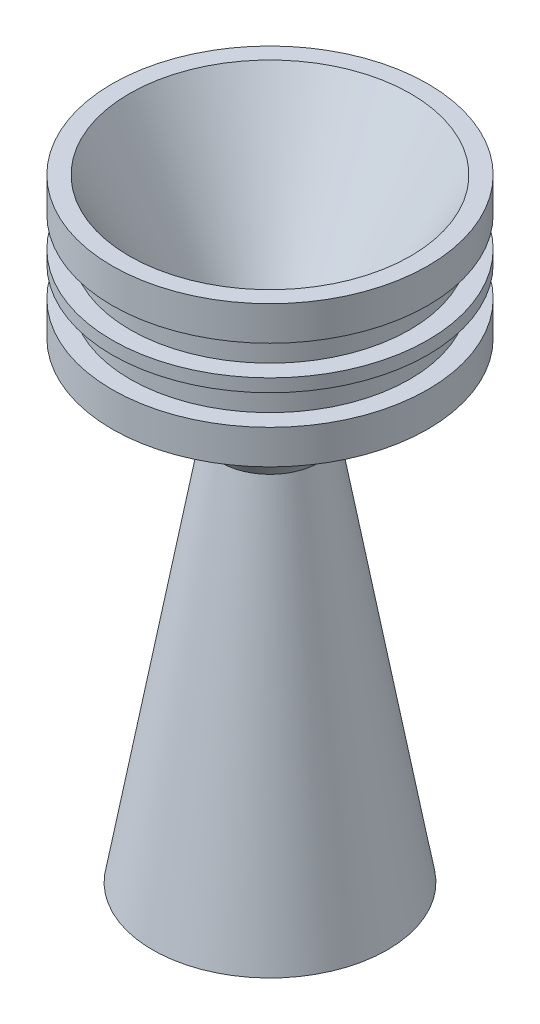
ISO-10303-21;
HEADER;
FILE_DESCRIPTION(('STEP AP214'),'2;1');
FILE_NAME('part.step','',(''),(''),'','','');
FILE_SCHEMA(('AUTOMOTIVE_DESIGN { 1 0 10303 214 1 1 1 1 }'));
ENDSEC;
DATA;
#1=APPLICATION_CONTEXT('core data for automotive mechanical design processes');
#2=APPLICATION_PROTOCOL_DEFINITION('international standard','automotive_design',2000,#1);
#3=PRODUCT_CONTEXT('',#1,'mechanical');
#4=PRODUCT('Part','Part','',(#3));
#5=PRODUCT_RELATED_PRODUCT_CATEGORY('part','',(#4));
#6=PRODUCT_DEFINITION_FORMATION('','',#4);
#7=PRODUCT_DEFINITION_CONTEXT('part definition',#1,'design');
#8=PRODUCT_DEFINITION('design','',#6,#7);
#9=PRODUCT_DEFINITION_SHAPE('','',#8);
#10=(LENGTH_UNIT() NAMED_UNIT(*) SI_UNIT(.MILLI.,.METRE.));
#11=(NAMED_UNIT(*) PLANE_ANGLE_UNIT() SI_UNIT($,.RADIAN.));
#12=(NAMED_UNIT(*) SI_UNIT($,.STERADIAN.) SOLID_ANGLE_UNIT());
#13=UNCERTAINTY_MEASURE_WITH_UNIT(LENGTH_MEASURE(1.E-05),#10,'distance_accuracy_value','');
#14=(GEOMETRIC_REPRESENTATION_CONTEXT(3) GLOBAL_UNCERTAINTY_ASSIGNED_CONTEXT((#13)) GLOBAL_UNIT_ASSIGNED_CONTEXT((#10,
#11,#12)) REPRESENTATION_CONTEXT('',''));
#15=CARTESIAN_POINT('',(0.,0.,0.));
#16=DIRECTION('',(0.,0.,1.));
#17=DIRECTION('',(1.,0.,0.));
#18=AXIS2_PLACEMENT_3D('',#15,#16,#17);
#19=CARTESIAN_POINT('',(0.,7.39312220767089,0.));
#20=DIRECTION('',(0.,-1.,0.));
#21=DIRECTION('',(1.,0.,0.));
#22=AXIS2_PLACEMENT_3D('',#19,#20,#21);
#23=PLANE('',#22);
#24=CARTESIAN_POINT('',(0.,7.3931222076709,0.));
#25=DIRECTION('',(0.,1.,0.));
#26=DIRECTION('',(-1.,0.,0.));
#27=AXIS2_PLACEMENT_3D('',#24,#25,#26);
#28=CIRCLE('',#27,11.4705977343054);
#29=CARTESIAN_POINT('',(-11.4705977343054,7.39312220767089,0.));
#30=VERTEX_POINT('',#29);
#31=EDGE_CURVE('E10',#30,#30,#28,.T.);
#32=ORIENTED_EDGE('',*,*,#31,.T.);
#33=EDGE_LOOP('',(#32));
#34=FACE_BOUND('',#33,.T.);
#35=CARTESIAN_POINT('',(0.,7.3931222076709,0.));
#36=DIRECTION('',(0.,1.,0.));
#37=DIRECTION('',(-1.,0.,0.));
#38=AXIS2_PLACEMENT_3D('',#35,#36,#37);
#39=CIRCLE('',#38,18.42);
#40=CARTESIAN_POINT('',(-18.42,7.39312220767089,0.));
#41=VERTEX_POINT('',#40);
#42=EDGE_CURVE('E87',#41,#41,#39,.T.);
#43=ORIENTED_EDGE('',*,*,#42,.F.);
#44=EDGE_LOOP('',(#43));
#45=FACE_BOUND('',#44,.T.);
#46=ADVANCED_FACE('F32',(#34,#45),#23,.T.);
#47=CARTESIAN_POINT('',(0.,7.3931222076709,0.));
#48=DIRECTION('',(0.,1.,0.));
#49=DIRECTION('',(-1.,0.,0.));
#50=AXIS2_PLACEMENT_3D('',#47,#48,#49);
#51=CONICAL_SURFACE('',#50,11.4705977343054,0.533655116690971);
#52=CARTESIAN_POINT('',(0.,-2.34542155856362,0.));
#53=DIRECTION('',(0.,1.,0.));
#54=DIRECTION('',(-1.,0.,0.));
#55=AXIS2_PLACEMENT_3D('',#52,#53,#54);
#56=CIRCLE('',#55,5.71670101973869);
#57=CARTESIAN_POINT('',(-5.71670101973869,-2.34542155856362,0.));
#58=VERTEX_POINT('',#57);
#59=EDGE_CURVE('E38',#58,#58,#56,.T.);
#60=ORIENTED_EDGE('',*,*,#59,.T.);
#61=EDGE_LOOP('',(#60));
#62=FACE_BOUND('',#61,.T.);
#63=ORIENTED_EDGE('',*,*,#31,.F.);
#64=EDGE_LOOP('',(#63));
#65=FACE_BOUND('',#64,.T.);
#66=ADVANCED_FACE('F95',(#62,#65),#51,.T.);
#67=CARTESIAN_POINT('',(0.,-47.6104108756905,0.));
#68=DIRECTION('',(0.,-1.,0.));
#69=DIRECTION('',(1.,0.,0.));
#70=AXIS2_PLACEMENT_3D('',#67,#68,#69);
#71=CONICAL_SURFACE('',#70,13.6981399178286,0.174532925199433);
#72=ORIENTED_EDGE('',*,*,#59,.F.);
#73=EDGE_LOOP('',(#72));
#74=FACE_BOUND('',#73,.T.);
#75=CARTESIAN_POINT('',(0.,-47.6104108756905,0.));
#76=DIRECTION('',(0.,1.,0.));
#77=DIRECTION('',(-1.,0.,0.));
#78=AXIS2_PLACEMENT_3D('',#75,#76,#77);
#79=CIRCLE('',#78,13.6981399178286);
#80=CARTESIAN_POINT('',(-13.6981399178286,-47.6104108756905,0.));
#81=VERTEX_POINT('',#80);
#82=EDGE_CURVE('E42',#81,#81,#79,.T.);
#83=ORIENTED_EDGE('',*,*,#82,.T.);
#84=EDGE_LOOP('',(#83));
#85=FACE_BOUND('',#84,.T.);
#86=ADVANCED_FACE('F99',(#74,#85),#71,.T.);
#87=CARTESIAN_POINT('',(0.,-47.6104108756905,0.));
#88=DIRECTION('',(0.,1.,0.));
#89=DIRECTION('',(-1.,0.,0.));
#90=AXIS2_PLACEMENT_3D('',#87,#88,#89);
#91=PLANE('',#90);
#92=ORIENTED_EDGE('',*,*,#82,.F.);
#93=EDGE_LOOP('',(#92));
#94=FACE_BOUND('',#93,.T.);
#95=CARTESIAN_POINT('',(0.,-47.6104108756905,0.));
#96=DIRECTION('',(0.,1.,0.));
#97=DIRECTION('',(-1.,0.,0.));
#98=AXIS2_PLACEMENT_3D('',#95,#96,#97);
#99=CIRCLE('',#98,12.175);
#100=CARTESIAN_POINT('',(12.175,-47.6104108756905,0.));
#101=VERTEX_POINT('',#100);
#102=EDGE_CURVE('E46',#101,#101,#99,.T.);
#103=ORIENTED_EDGE('',*,*,#102,.T.);
#104=EDGE_LOOP('',(#103));
#105=FACE_BOUND('',#104,.T.);
#106=ADVANCED_FACE('F103',(#94,#105),#91,.F.);
#107=CARTESIAN_POINT('',(0.,0.,0.));
#108=DIRECTION('',(0.,-1.,0.));
#109=DIRECTION('',(1.,0.,0.));
#110=AXIS2_PLACEMENT_3D('',#107,#108,#109);
#111=CONICAL_SURFACE('',#110,3.78000000000001,0.174532925199433);
#112=CARTESIAN_POINT('',(0.,0.,0.));
#113=DIRECTION('',(0.,1.,0.));
#114=DIRECTION('',(-1.,0.,0.));
#115=AXIS2_PLACEMENT_3D('',#112,#113,#114);
#116=CIRCLE('',#115,3.78000000000001);
#117=CARTESIAN_POINT('',(3.78000000000001,0.,0.));
#118=VERTEX_POINT('',#117);
#119=EDGE_CURVE('E51',#118,#118,#116,.T.);
#120=CARTESIAN_POINT('',(12.175,-47.6104108756905,0.));
#121=CARTESIAN_POINT('',(12.0875520833333,-47.1144690957354,0.));
#122=CARTESIAN_POINT('',(12.0001041666667,-46.6185273157803,0.));
#123=CARTESIAN_POINT('',(11.8252083333333,-45.6266437558701,0.));
#124=CARTESIAN_POINT('',(11.7377604166667,-45.130701975915,0.));
#125=CARTESIAN_POINT('',(11.5628645833333,-44.1388184160048,0.));
#126=CARTESIAN_POINT('',(11.4754166666667,-43.6428766360497,0.));
#127=CARTESIAN_POINT('',(11.3005208333333,-42.6509930761395,0.));
#128=CARTESIAN_POINT('',(11.2130729166667,-42.1550512961843,0.));
#129=CARTESIAN_POINT('',(11.0381770833333,-41.1631677362741,0.));
#130=CARTESIAN_POINT('',(10.9507291666667,-40.667225956319,0.));
#131=CARTESIAN_POINT('',(10.7758333333333,-39.6753423964088,0.));
#132=CARTESIAN_POINT('',(10.6883854166667,-39.1794006164537,0.));
#133=CARTESIAN_POINT('',(10.5134895833333,-38.1875170565435,0.));
#134=CARTESIAN_POINT('',(10.4260416666667,-37.6915752765883,0.));
#135=CARTESIAN_POINT('',(10.2511458333333,-36.6996917166781,0.));
#136=CARTESIAN_POINT('',(10.1636979166667,-36.203749936723,0.));
#137=CARTESIAN_POINT('',(9.98880208333334,-35.2118663768128,0.));
#138=CARTESIAN_POINT('',(9.90135416666668,-34.7159245968577,0.));
#139=CARTESIAN_POINT('',(9.72645833333334,-33.7240410369475,0.));
#140=CARTESIAN_POINT('',(9.63901041666668,-33.2280992569924,0.));
#141=CARTESIAN_POINT('',(9.46411458333334,-32.2362156970821,0.));
#142=CARTESIAN_POINT('',(9.37666666666668,-31.740273917127,0.));
#143=CARTESIAN_POINT('',(9.20177083333334,-30.7483903572168,0.));
#144=CARTESIAN_POINT('',(9.11432291666668,-30.2524485772617,0.));
#145=CARTESIAN_POINT('',(8.93942708333334,-29.2605650173515,0.));
#146=CARTESIAN_POINT('',(8.85197916666668,-28.7646232373964,0.));
#147=CARTESIAN_POINT('',(8.67708333333334,-27.7727396774861,0.));
#148=CARTESIAN_POINT('',(8.58963541666668,-27.276797897531,0.));
#149=CARTESIAN_POINT('',(8.41473958333334,-26.2849143376208,0.));
#150=CARTESIAN_POINT('',(8.32729166666668,-25.7889725576657,0.));
#151=CARTESIAN_POINT('',(8.15239583333334,-24.7970889977555,0.));
#152=CARTESIAN_POINT('',(8.06494791666668,-24.3011472178004,0.));
#153=CARTESIAN_POINT('',(7.89005208333334,-23.3092636578902,0.));
#154=CARTESIAN_POINT('',(7.80260416666668,-22.8133218779351,0.));
#155=CARTESIAN_POINT('',(7.62770833333334,-21.8214383180248,0.));
#156=CARTESIAN_POINT('',(7.54026041666668,-21.3254965380697,0.));
#157=CARTESIAN_POINT('',(7.36536458333334,-20.3336129781595,0.));
#158=CARTESIAN_POINT('',(7.27791666666668,-19.8376711982044,0.));
#159=CARTESIAN_POINT('',(7.10302083333334,-18.8457876382942,0.));
#160=CARTESIAN_POINT('',(7.01557291666668,-18.3498458583391,0.));
#161=CARTESIAN_POINT('',(6.84067708333334,-17.3579622984288,0.));
#162=CARTESIAN_POINT('',(6.75322916666668,-16.8620205184737,0.));
#163=CARTESIAN_POINT('',(6.57833333333334,-15.8701369585635,0.));
#164=CARTESIAN_POINT('',(6.49088541666668,-15.3741951786084,0.));
#165=CARTESIAN_POINT('',(6.31598958333334,-14.3823116186982,0.));
#166=CARTESIAN_POINT('',(6.22854166666668,-13.8863698387431,0.));
#167=CARTESIAN_POINT('',(6.05364583333334,-12.8944862788329,0.));
#168=CARTESIAN_POINT('',(5.96619791666668,-12.3985444988777,0.));
#169=CARTESIAN_POINT('',(5.79130208333334,-11.4066609389675,0.));
#170=CARTESIAN_POINT('',(5.70385416666668,-10.9107191590124,0.));
#171=CARTESIAN_POINT('',(5.52895833333334,-9.9188355991022,0.));
#172=CARTESIAN_POINT('',(5.44151041666668,-9.42289381914709,0.));
#173=CARTESIAN_POINT('',(5.26661458333334,-8.43101025923687,0.));
#174=CARTESIAN_POINT('',(5.17916666666668,-7.93506847928176,0.));
#175=CARTESIAN_POINT('',(5.00427083333334,-6.94318491937154,0.));
#176=CARTESIAN_POINT('',(4.91682291666668,-6.44724313941642,0.));
#177=CARTESIAN_POINT('',(4.74192708333334,-5.4553595795062,0.));
#178=CARTESIAN_POINT('',(4.65447916666668,-4.95941779955109,0.));
#179=CARTESIAN_POINT('',(4.47958333333334,-3.96753423964087,0.));
#180=CARTESIAN_POINT('',(4.39213541666668,-3.47159245968577,0.));
#181=CARTESIAN_POINT('',(4.21723958333334,-2.47970889977555,0.));
#182=CARTESIAN_POINT('',(4.12979166666668,-1.98376711982044,0.));
#183=CARTESIAN_POINT('',(3.95489583333334,-0.991883559910219,0.));
#184=CARTESIAN_POINT('',(3.86744791666668,-0.495941779955109,0.));
#185=CARTESIAN_POINT('',(3.78000000000001,0.,0.));
#186=B_SPLINE_CURVE_WITH_KNOTS('',3,(#120,#121,#122,#123,#124,#125,#126,#127,#128,#129,#130,
#131,#132,#133,#134,#135,#136,#137,#138,#139,#140,#141,#142,#143,#144,#145,#146,#147,#148,#149,
#150,#151,#152,#153,#154,#155,#156,#157,#158,#159,#160,#161,#162,#163,#164,#165,#166,#167,#168,
#169,#170,#171,#172,#173,#174,#175,#176,#177,#178,#179,#180,#181,#182,#183,#184,#185),
.UNSPECIFIED.,.F.,.F.,(4,2,2,2,2,2,2,2,2,2,2,2,2,2,2,2,2,2,2,2,2,2,2,2,2,2,2,2,2,2,2,2,4),(0.,
1.51077744393721,3.02155488787441,4.53233233181162,6.04310977574883,7.55388721968605,
9.06466466362325,10.5754421075605,12.0862195514977,13.5969969954349,15.1077744393721,
16.6185518833093,18.1293293272465,19.6401067711837,21.1508842151209,22.6616616590581,
24.1724391029953,25.6832165469325,27.1939939908698,28.704771434807,30.2155488787442,
31.7263263226814,33.2371037666186,34.7478812105558,36.258658654493,37.7694360984302,
39.2802135423674,40.7909909863046,42.3017684302418,43.8125458741791,45.3233233181163,
46.8341007620535,48.3448782059907),.UNSPECIFIED.);
#187=EDGE_CURVE('BSEAM110',#101,#118,#186,.T.);
#188=ORIENTED_EDGE('',*,*,#102,.F.);
#189=ORIENTED_EDGE('',*,*,#119,.T.);
#190=ORIENTED_EDGE('',*,*,#187,.T.);
#191=ORIENTED_EDGE('',*,*,#187,.F.);
#192=EDGE_LOOP('',(#188,#190,#189,#191));
#193=FACE_BOUND('',#192,.T.);
#194=ADVANCED_FACE('F110',(#193),#111,.F.);
#195=CARTESIAN_POINT('',(0.,41.7491771597277,0.));
#196=DIRECTION('',(0.,1.,0.));
#197=DIRECTION('',(-1.,0.,0.));
#198=AXIS2_PLACEMENT_3D('',#195,#196,#197);
#199=CYLINDRICAL_SURFACE('',#198,3.78);
#200=CARTESIAN_POINT('',(0.,2.,0.));
#201=DIRECTION('',(0.,1.,0.));
#202=DIRECTION('',(-1.,0.,0.));
#203=AXIS2_PLACEMENT_3D('',#200,#201,#202);
#204=CIRCLE('',#203,3.78);
#205=CARTESIAN_POINT('',(-3.78,2.,0.));
#206=VERTEX_POINT('',#205);
#207=EDGE_CURVE('E54',#206,#206,#204,.T.);
#208=ORIENTED_EDGE('',*,*,#207,.T.);
#209=EDGE_LOOP('',(#208));
#210=FACE_BOUND('',#209,.T.);
#211=ORIENTED_EDGE('',*,*,#119,.F.);
#212=EDGE_LOOP('',(#211));
#213=FACE_BOUND('',#212,.T.);
#214=ADVANCED_FACE('F114',(#210,#213),#199,.F.);
#215=CARTESIAN_POINT('',(0.,2.,0.));
#216=DIRECTION('',(0.,1.,0.));
#217=DIRECTION('',(-1.,0.,0.));
#218=AXIS2_PLACEMENT_3D('',#215,#216,#217);
#219=CONICAL_SURFACE('',#218,3.78,0.523598775598293);
#220=CARTESIAN_POINT('',(0.,23.8931222076709,0.));
#221=DIRECTION('',(0.,1.,0.));
#222=DIRECTION('',(-1.,0.,0.));
#223=AXIS2_PLACEMENT_3D('',#220,#221,#222);
#224=CIRCLE('',#223,16.42);
#225=CARTESIAN_POINT('',(-16.42,23.8931222076709,0.));
#226=VERTEX_POINT('',#225);
#227=EDGE_CURVE('E57',#226,#226,#224,.T.);
#228=CARTESIAN_POINT('',(-16.42,23.8931222076709,0.));
#229=CARTESIAN_POINT('',(-16.2883333333333,23.665068851341,0.));
#230=CARTESIAN_POINT('',(-16.1566666666667,23.4370154950111,0.));
#231=CARTESIAN_POINT('',(-15.8933333333333,22.9809087823513,0.));
#232=CARTESIAN_POINT('',(-15.7616666666667,22.7528554260214,0.));
#233=CARTESIAN_POINT('',(-15.4983333333333,22.2967487133616,0.));
#234=CARTESIAN_POINT('',(-15.3666666666667,22.0686953570317,0.));
#235=CARTESIAN_POINT('',(-15.1033333333333,21.6125886443719,0.));
#236=CARTESIAN_POINT('',(-14.9716666666667,21.3845352880419,0.));
#237=CARTESIAN_POINT('',(-14.7083333333333,20.9284285753821,0.));
#238=CARTESIAN_POINT('',(-14.5766666666667,20.7003752190522,0.));
#239=CARTESIAN_POINT('',(-14.3133333333333,20.2442685063924,0.));
#240=CARTESIAN_POINT('',(-14.1816666666667,20.0162151500625,0.));
#241=CARTESIAN_POINT('',(-13.9183333333333,19.5601084374027,0.));
#242=CARTESIAN_POINT('',(-13.7866666666667,19.3320550810728,0.));
#243=CARTESIAN_POINT('',(-13.5233333333333,18.875948368413,0.));
#244=CARTESIAN_POINT('',(-13.3916666666667,18.6478950120831,0.));
#245=CARTESIAN_POINT('',(-13.1283333333333,18.1917882994233,0.));
#246=CARTESIAN_POINT('',(-12.9966666666667,17.9637349430934,0.));
#247=CARTESIAN_POINT('',(-12.7333333333333,17.5076282304336,0.));
#248=CARTESIAN_POINT('',(-12.6016666666667,17.2795748741037,0.));
#249=CARTESIAN_POINT('',(-12.3383333333333,16.8234681614438,0.));
#250=CARTESIAN_POINT('',(-12.2066666666667,16.5954148051139,0.));
#251=CARTESIAN_POINT('',(-11.9433333333333,16.1393080924541,0.));
#252=CARTESIAN_POINT('',(-11.8116666666667,15.9112547361242,0.));
#253=CARTESIAN_POINT('',(-11.5483333333333,15.4551480234644,0.));
#254=CARTESIAN_POINT('',(-11.4166666666667,15.2270946671345,0.));
#255=CARTESIAN_POINT('',(-11.1533333333333,14.7709879544747,0.));
#256=CARTESIAN_POINT('',(-11.0216666666667,14.5429345981448,0.));
#257=CARTESIAN_POINT('',(-10.7583333333333,14.086827885485,0.));
#258=CARTESIAN_POINT('',(-10.6266666666667,13.8587745291551,0.));
#259=CARTESIAN_POINT('',(-10.3633333333333,13.4026678164953,0.));
#260=CARTESIAN_POINT('',(-10.2316666666667,13.1746144601654,0.));
#261=CARTESIAN_POINT('',(-9.96833333333333,12.7185077475055,0.));
#262=CARTESIAN_POINT('',(-9.83666666666667,12.4904543911756,0.));
#263=CARTESIAN_POINT('',(-9.57333333333333,12.0343476785158,0.));
#264=CARTESIAN_POINT('',(-9.44166666666667,11.8062943221859,0.));
#265=CARTESIAN_POINT('',(-9.17833333333333,11.3501876095261,0.));
#266=CARTESIAN_POINT('',(-9.04666666666667,11.1221342531962,0.));
#267=CARTESIAN_POINT('',(-8.78333333333333,10.6660275405364,0.));
#268=CARTESIAN_POINT('',(-8.65166666666667,10.4379741842065,0.));
#269=CARTESIAN_POINT('',(-8.38833333333333,9.98186747154669,0.));
#270=CARTESIAN_POINT('',(-8.25666666666667,9.75381411521678,0.));
#271=CARTESIAN_POINT('',(-7.99333333333333,9.29770740255697,0.));
#272=CARTESIAN_POINT('',(-7.86166666666667,9.06965404622706,0.));
#273=CARTESIAN_POINT('',(-7.59833333333333,8.61354733356725,0.));
#274=CARTESIAN_POINT('',(-7.46666666666667,8.38549397723735,0.));
#275=CARTESIAN_POINT('',(-7.20333333333333,7.92938726457754,0.));
#276=CARTESIAN_POINT('',(-7.07166666666667,7.70133390824763,0.));
#277=CARTESIAN_POINT('',(-6.80833333333333,7.24522719558782,0.));
#278=CARTESIAN_POINT('',(-6.67666666666667,7.01717383925792,0.));
#279=CARTESIAN_POINT('',(-6.41333333333333,6.56106712659811,0.));
#280=CARTESIAN_POINT('',(-6.28166666666667,6.3330137702682,0.));
#281=CARTESIAN_POINT('',(-6.01833333333333,5.87690705760839,0.));
#282=CARTESIAN_POINT('',(-5.88666666666667,5.64885370127848,0.));
#283=CARTESIAN_POINT('',(-5.62333333333333,5.19274698861867,0.));
#284=CARTESIAN_POINT('',(-5.49166666666667,4.96469363228877,0.));
#285=CARTESIAN_POINT('',(-5.22833333333333,4.50858691962896,0.));
#286=CARTESIAN_POINT('',(-5.09666666666666,4.28053356329905,0.));
#287=CARTESIAN_POINT('',(-4.83333333333333,3.82442685063924,0.));
#288=CARTESIAN_POINT('',(-4.70166666666667,3.59637349430934,0.));
#289=CARTESIAN_POINT('',(-4.43833333333333,3.14026678164953,0.));
#290=CARTESIAN_POINT('',(-4.30666666666667,2.91221342531962,0.));
#291=CARTESIAN_POINT('',(-4.04333333333333,2.45610671265981,0.));
#292=CARTESIAN_POINT('',(-3.91166666666667,2.22805335632991,0.));
#293=CARTESIAN_POINT('',(-3.78,2.,0.));
#294=B_SPLINE_CURVE_WITH_KNOTS('',3,(#228,#229,#230,#231,#232,#233,#234,#235,#236,#237,#238,
#239,#240,#241,#242,#243,#244,#245,#246,#247,#248,#249,#250,#251,#252,#253,#254,#255,#256,#257,
#258,#259,#260,#261,#262,#263,#264,#265,#266,#267,#268,#269,#270,#271,#272,#273,#274,#275,#276,
#277,#278,#279,#280,#281,#282,#283,#284,#285,#286,#287,#288,#289,#290,#291,#292,#293),
.UNSPECIFIED.,.F.,.F.,(4,2,2,2,2,2,2,2,2,2,2,2,2,2,2,2,2,2,2,2,2,2,2,2,2,2,2,2,2,2,2,2,4),(0.,
0.790000000000008,1.58000000000002,2.37000000000002,3.16000000000003,3.95000000000004,
4.74000000000005,5.53000000000005,6.32000000000006,7.11000000000007,7.90000000000008,
8.69000000000009,9.48000000000009,10.2700000000001,11.0600000000001,11.8500000000001,
12.6400000000001,13.4300000000001,14.2200000000001,15.0100000000001,15.8000000000002,
16.5900000000002,17.3800000000002,18.1700000000002,18.9600000000002,19.7500000000002,
20.5400000000002,21.3300000000002,22.1200000000002,22.9100000000002,23.7000000000002,
24.4900000000002,25.2800000000003),.UNSPECIFIED.);
#295=EDGE_CURVE('BSEAM118',#226,#206,#294,.T.);
#296=ORIENTED_EDGE('',*,*,#227,.T.);
#297=ORIENTED_EDGE('',*,*,#207,.F.);
#298=ORIENTED_EDGE('',*,*,#295,.T.);
#299=ORIENTED_EDGE('',*,*,#295,.F.);
#300=EDGE_LOOP('',(#296,#298,#297,#299));
#301=FACE_BOUND('',#300,.T.);
#302=ADVANCED_FACE('F118',(#301),#219,.F.);
#303=CARTESIAN_POINT('',(0.,23.8931222076709,0.));
#304=DIRECTION('',(0.,1.,0.));
#305=DIRECTION('',(-1.,0.,0.));
#306=AXIS2_PLACEMENT_3D('',#303,#304,#305);
#307=PLANE('',#306);
#308=CARTESIAN_POINT('',(0.,23.8931222076709,0.));
#309=DIRECTION('',(0.,1.,0.));
#310=DIRECTION('',(-1.,0.,0.));
#311=AXIS2_PLACEMENT_3D('',#308,#309,#310);
#312=CIRCLE('',#311,18.42);
#313=CARTESIAN_POINT('',(-18.42,23.8931222076709,0.));
#314=VERTEX_POINT('',#313);
#315=EDGE_CURVE('E60',#314,#314,#312,.T.);
#316=ORIENTED_EDGE('',*,*,#315,.T.);
#317=EDGE_LOOP('',(#316));
#318=FACE_BOUND('',#317,.T.);
#319=ORIENTED_EDGE('',*,*,#227,.F.);
#320=EDGE_LOOP('',(#319));
#321=FACE_BOUND('',#320,.T.);
#322=ADVANCED_FACE('F122',(#318,#321),#307,.T.);
#323=CARTESIAN_POINT('',(0.,41.7491771597277,0.));
#324=DIRECTION('',(0.,1.,0.));
#325=DIRECTION('',(-1.,0.,0.));
#326=AXIS2_PLACEMENT_3D('',#323,#324,#325);
#327=CYLINDRICAL_SURFACE('',#326,18.42);
#328=CARTESIAN_POINT('',(0.,19.8931222076709,0.));
#329=DIRECTION('',(0.,1.,0.));
#330=DIRECTION('',(-1.,0.,0.));
#331=AXIS2_PLACEMENT_3D('',#328,#329,#330);
#332=CIRCLE('',#331,18.42);
#333=CARTESIAN_POINT('',(-18.42,19.8931222076709,0.));
#334=VERTEX_POINT('',#333);
#335=EDGE_CURVE('E63',#334,#334,#332,.T.);
#336=ORIENTED_EDGE('',*,*,#335,.T.);
#337=EDGE_LOOP('',(#336));
#338=FACE_BOUND('',#337,.T.);
#339=ORIENTED_EDGE('',*,*,#315,.F.);
#340=EDGE_LOOP('',(#339));
#341=FACE_BOUND('',#340,.T.);
#342=ADVANCED_FACE('F126',(#338,#341),#327,.T.);
#343=CARTESIAN_POINT('',(0.,19.8931222076709,0.));
#344=DIRECTION('',(0.,-1.,0.));
#345=DIRECTION('',(1.,0.,0.));
#346=AXIS2_PLACEMENT_3D('',#343,#344,#345);
#347=PLANE('',#346);
#348=CARTESIAN_POINT('',(0.,19.8931222076709,0.));
#349=DIRECTION('',(0.,1.,0.));
#350=DIRECTION('',(-1.,0.,0.));
#351=AXIS2_PLACEMENT_3D('',#348,#349,#350);
#352=CIRCLE('',#351,16.32);
#353=CARTESIAN_POINT('',(-16.32,19.8931222076709,0.));
#354=VERTEX_POINT('',#353);
#355=EDGE_CURVE('E66',#354,#354,#352,.T.);
#356=ORIENTED_EDGE('',*,*,#355,.T.);
#357=EDGE_LOOP('',(#356));
#358=FACE_BOUND('',#357,.T.);
#359=ORIENTED_EDGE('',*,*,#335,.F.);
#360=EDGE_LOOP('',(#359));
#361=FACE_BOUND('',#360,.T.);
#362=ADVANCED_FACE('F130',(#358,#361),#347,.T.);
#363=CARTESIAN_POINT('',(0.,41.7491771597277,0.));
#364=DIRECTION('',(0.,1.,0.));
#365=DIRECTION('',(-1.,0.,0.));
#366=AXIS2_PLACEMENT_3D('',#363,#364,#365);
#367=CYLINDRICAL_SURFACE('',#366,16.32);
#368=CARTESIAN_POINT('',(0.,16.3931222076709,0.));
#369=DIRECTION('',(0.,1.,0.));
#370=DIRECTION('',(-1.,0.,0.));
#371=AXIS2_PLACEMENT_3D('',#368,#369,#370);
#372=CIRCLE('',#371,16.32);
#373=CARTESIAN_POINT('',(-16.32,16.3931222076709,0.));
#374=VERTEX_POINT('',#373);
#375=EDGE_CURVE('E69',#374,#374,#372,.T.);
#376=ORIENTED_EDGE('',*,*,#375,.T.);
#377=EDGE_LOOP('',(#376));
#378=FACE_BOUND('',#377,.T.);
#379=ORIENTED_EDGE('',*,*,#355,.F.);
#380=EDGE_LOOP('',(#379));
#381=FACE_BOUND('',#380,.T.);
#382=ADVANCED_FACE('F134',(#378,#381),#367,.T.);
#383=CARTESIAN_POINT('',(0.,16.3931222076709,0.));
#384=DIRECTION('',(0.,1.,0.));
#385=DIRECTION('',(-1.,0.,0.));
#386=AXIS2_PLACEMENT_3D('',#383,#384,#385);
#387=PLANE('',#386);
#388=CARTESIAN_POINT('',(0.,16.3931222076709,0.));
#389=DIRECTION('',(0.,1.,0.));
#390=DIRECTION('',(-1.,0.,0.));
#391=AXIS2_PLACEMENT_3D('',#388,#389,#390);
#392=CIRCLE('',#391,18.42);
#393=CARTESIAN_POINT('',(-18.42,16.3931222076709,0.));
#394=VERTEX_POINT('',#393);
#395=EDGE_CURVE('E72',#394,#394,#392,.T.);
#396=ORIENTED_EDGE('',*,*,#395,.T.);
#397=EDGE_LOOP('',(#396));
#398=FACE_BOUND('',#397,.T.);
#399=ORIENTED_EDGE('',*,*,#375,.F.);
#400=EDGE_LOOP('',(#399));
#401=FACE_BOUND('',#400,.T.);
#402=ADVANCED_FACE('F138',(#398,#401),#387,.T.);
#403=CARTESIAN_POINT('',(0.,41.7491771597277,0.));
#404=DIRECTION('',(0.,1.,0.));
#405=DIRECTION('',(-1.,0.,0.));
#406=AXIS2_PLACEMENT_3D('',#403,#404,#405);
#407=CYLINDRICAL_SURFACE('',#406,18.42);
#408=CARTESIAN_POINT('',(0.,14.8931222076709,0.));
#409=DIRECTION('',(0.,1.,0.));
#410=DIRECTION('',(-1.,0.,0.));
#411=AXIS2_PLACEMENT_3D('',#408,#409,#410);
#412=CIRCLE('',#411,18.42);
#413=CARTESIAN_POINT('',(-18.42,14.8931222076709,0.));
#414=VERTEX_POINT('',#413);
#415=EDGE_CURVE('E75',#414,#414,#412,.T.);
#416=ORIENTED_EDGE('',*,*,#415,.T.);
#417=EDGE_LOOP('',(#416));
#418=FACE_BOUND('',#417,.T.);
#419=ORIENTED_EDGE('',*,*,#395,.F.);
#420=EDGE_LOOP('',(#419));
#421=FACE_BOUND('',#420,.T.);
#422=ADVANCED_FACE('F142',(#418,#421),#407,.T.);
#423=CARTESIAN_POINT('',(0.,14.8931222076709,0.));
#424=DIRECTION('',(0.,-1.,0.));
#425=DIRECTION('',(1.,0.,0.));
#426=AXIS2_PLACEMENT_3D('',#423,#424,#425);
#427=PLANE('',#426);
#428=CARTESIAN_POINT('',(0.,14.8931222076709,0.));
#429=DIRECTION('',(0.,1.,0.));
#430=DIRECTION('',(-1.,0.,0.));
#431=AXIS2_PLACEMENT_3D('',#428,#429,#430);
#432=CIRCLE('',#431,16.32);
#433=CARTESIAN_POINT('',(-16.32,14.8931222076709,0.));
#434=VERTEX_POINT('',#433);
#435=EDGE_CURVE('E78',#434,#434,#432,.T.);
#436=ORIENTED_EDGE('',*,*,#435,.T.);
#437=EDGE_LOOP('',(#436));
#438=FACE_BOUND('',#437,.T.);
#439=ORIENTED_EDGE('',*,*,#415,.F.);
#440=EDGE_LOOP('',(#439));
#441=FACE_BOUND('',#440,.T.);
#442=ADVANCED_FACE('F146',(#438,#441),#427,.T.);
#443=CARTESIAN_POINT('',(0.,41.7491771597277,0.));
#444=DIRECTION('',(0.,1.,0.));
#445=DIRECTION('',(-1.,0.,0.));
#446=AXIS2_PLACEMENT_3D('',#443,#444,#445);
#447=CYLINDRICAL_SURFACE('',#446,16.32);
#448=CARTESIAN_POINT('',(0.,11.3931222076709,0.));
#449=DIRECTION('',(0.,1.,0.));
#450=DIRECTION('',(-1.,0.,0.));
#451=AXIS2_PLACEMENT_3D('',#448,#449,#450);
#452=CIRCLE('',#451,16.32);
#453=CARTESIAN_POINT('',(-16.32,11.3931222076709,0.));
#454=VERTEX_POINT('',#453);
#455=EDGE_CURVE('E81',#454,#454,#452,.T.);
#456=ORIENTED_EDGE('',*,*,#455,.T.);
#457=EDGE_LOOP('',(#456));
#458=FACE_BOUND('',#457,.T.);
#459=ORIENTED_EDGE('',*,*,#435,.F.);
#460=EDGE_LOOP('',(#459));
#461=FACE_BOUND('',#460,.T.);
#462=ADVANCED_FACE('F150',(#458,#461),#447,.T.);
#463=CARTESIAN_POINT('',(0.,11.3931222076709,0.));
#464=DIRECTION('',(0.,1.,0.));
#465=DIRECTION('',(-1.,0.,0.));
#466=AXIS2_PLACEMENT_3D('',#463,#464,#465);
#467=PLANE('',#466);
#468=CARTESIAN_POINT('',(0.,11.3931222076709,0.));
#469=DIRECTION('',(0.,1.,0.));
#470=DIRECTION('',(-1.,0.,0.));
#471=AXIS2_PLACEMENT_3D('',#468,#469,#470);
#472=CIRCLE('',#471,18.42);
#473=CARTESIAN_POINT('',(-18.42,11.3931222076709,0.));
#474=VERTEX_POINT('',#473);
#475=EDGE_CURVE('E84',#474,#474,#472,.T.);
#476=ORIENTED_EDGE('',*,*,#475,.T.);
#477=EDGE_LOOP('',(#476));
#478=FACE_BOUND('',#477,.T.);
#479=ORIENTED_EDGE('',*,*,#455,.F.);
#480=EDGE_LOOP('',(#479));
#481=FACE_BOUND('',#480,.T.);
#482=ADVANCED_FACE('F154',(#478,#481),#467,.T.);
#483=CARTESIAN_POINT('',(0.,41.7491771597277,0.));
#484=DIRECTION('',(0.,1.,0.));
#485=DIRECTION('',(-1.,0.,0.));
#486=AXIS2_PLACEMENT_3D('',#483,#484,#485);
#487=CYLINDRICAL_SURFACE('',#486,18.42);
#488=ORIENTED_EDGE('',*,*,#42,.T.);
#489=EDGE_LOOP('',(#488));
#490=FACE_BOUND('',#489,.T.);
#491=ORIENTED_EDGE('',*,*,#475,.F.);
#492=EDGE_LOOP('',(#491));
#493=FACE_BOUND('',#492,.T.);
#494=ADVANCED_FACE('F91',(#490,#493),#487,.T.);
#495=CLOSED_SHELL('',(#46,#66,#86,#106,#194,#214,#302,#322,#342,#362,#382,#402,#422,#442,#462,
#482,#494));
#496=MANIFOLD_SOLID_BREP('B2',#495);
#497=ADVANCED_BREP_SHAPE_REPRESENTATION('',(#18,#496),#14);
#498=SHAPE_DEFINITION_REPRESENTATION(#9,#497);
ENDSEC;
END-ISO-10303-21;
